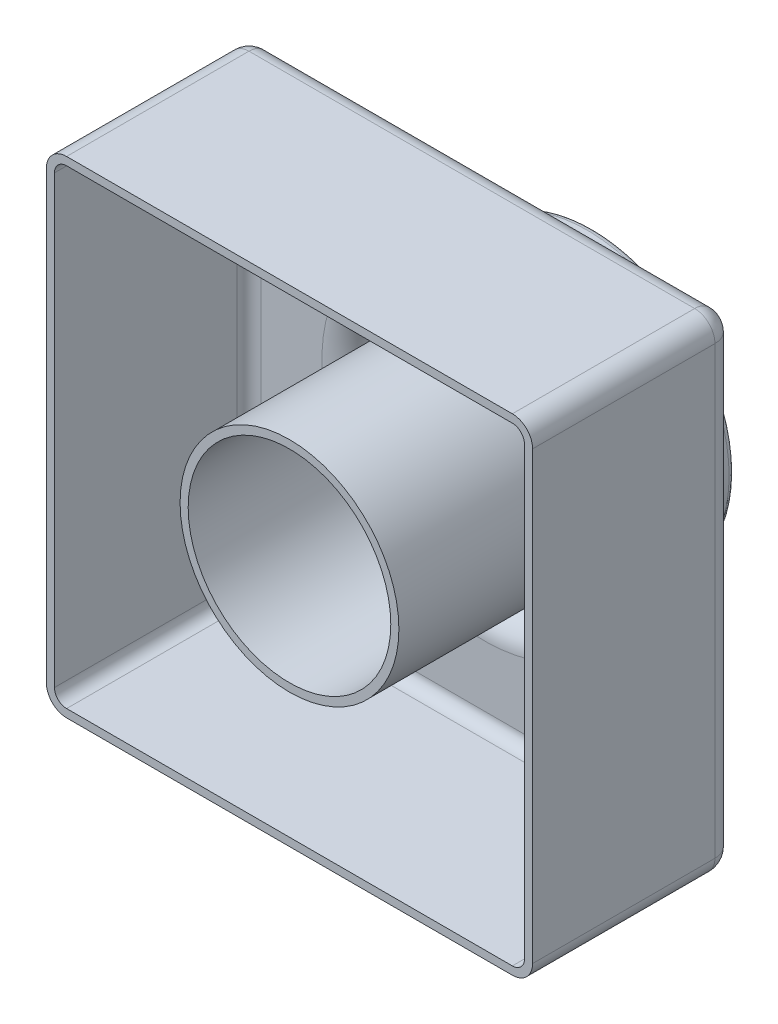
ISO-10303-21;
HEADER;
FILE_DESCRIPTION(('STEP AP214'),'2;1');
FILE_NAME('part.step','',(''),(''),'','','');
FILE_SCHEMA(('AUTOMOTIVE_DESIGN { 1 0 10303 214 1 1 1 1 }'));
ENDSEC;
DATA;
#1=APPLICATION_CONTEXT('core data for automotive mechanical design processes');
#2=APPLICATION_PROTOCOL_DEFINITION('international standard','automotive_design',2000,#1);
#3=PRODUCT_CONTEXT('',#1,'mechanical');
#4=PRODUCT('Part','Part','',(#3));
#5=PRODUCT_RELATED_PRODUCT_CATEGORY('part','',(#4));
#6=PRODUCT_DEFINITION_FORMATION('','',#4);
#7=PRODUCT_DEFINITION_CONTEXT('part definition',#1,'design');
#8=PRODUCT_DEFINITION('design','',#6,#7);
#9=PRODUCT_DEFINITION_SHAPE('','',#8);
#10=(LENGTH_UNIT() NAMED_UNIT(*) SI_UNIT(.MILLI.,.METRE.));
#11=(NAMED_UNIT(*) PLANE_ANGLE_UNIT() SI_UNIT($,.RADIAN.));
#12=(NAMED_UNIT(*) SI_UNIT($,.STERADIAN.) SOLID_ANGLE_UNIT());
#13=UNCERTAINTY_MEASURE_WITH_UNIT(LENGTH_MEASURE(1.E-05),#10,'distance_accuracy_value','');
#14=(GEOMETRIC_REPRESENTATION_CONTEXT(3) GLOBAL_UNCERTAINTY_ASSIGNED_CONTEXT((#13)) GLOBAL_UNIT_ASSIGNED_CONTEXT((#10,
#11,#12)) REPRESENTATION_CONTEXT('',''));
#15=CARTESIAN_POINT('',(0.,0.,0.));
#16=DIRECTION('',(0.,0.,1.));
#17=DIRECTION('',(1.,0.,0.));
#18=AXIS2_PLACEMENT_3D('',#15,#16,#17);
#19=CARTESIAN_POINT('',(0.,0.,50.));
#20=DIRECTION('',(0.,0.,1.));
#21=DIRECTION('',(1.,0.,0.));
#22=AXIS2_PLACEMENT_3D('',#19,#20,#21);
#23=PLANE('',#22);
#24=DIRECTION('',(1.,0.,0.));
#25=VECTOR('',#24,1.);
#26=CARTESIAN_POINT('',(0.,0.,50.));
#27=LINE('',#26,#25);
#28=CARTESIAN_POINT('',(5.,0.,50.));
#29=VERTEX_POINT('',#28);
#30=CARTESIAN_POINT('',(115.,0.,50.));
#31=VERTEX_POINT('',#30);
#32=EDGE_CURVE('E278',#29,#31,#27,.T.);
#33=ORIENTED_EDGE('',*,*,#32,.F.);
#34=CARTESIAN_POINT('',(5.,-5.,50.));
#35=DIRECTION('',(0.,0.,1.));
#36=DIRECTION('',(1.,0.,0.));
#37=AXIS2_PLACEMENT_3D('',#34,#35,#36);
#38=CIRCLE('',#37,5.);
#39=CARTESIAN_POINT('',(0.,-5.,50.));
#40=VERTEX_POINT('',#39);
#41=EDGE_CURVE('E304',#29,#40,#38,.T.);
#42=ORIENTED_EDGE('',*,*,#41,.T.);
#43=DIRECTION('',(0.,-1.,0.));
#44=VECTOR('',#43,1.);
#45=CARTESIAN_POINT('',(0.,0.,50.));
#46=LINE('',#45,#44);
#47=CARTESIAN_POINT('',(0.,-115.,50.));
#48=VERTEX_POINT('',#47);
#49=EDGE_CURVE('E266',#40,#48,#46,.T.);
#50=ORIENTED_EDGE('',*,*,#49,.T.);
#51=CARTESIAN_POINT('',(5.,-115.,50.));
#52=DIRECTION('',(0.,0.,1.));
#53=DIRECTION('',(1.,0.,0.));
#54=AXIS2_PLACEMENT_3D('',#51,#52,#53);
#55=CIRCLE('',#54,5.);
#56=CARTESIAN_POINT('',(5.,-120.,50.));
#57=VERTEX_POINT('',#56);
#58=EDGE_CURVE('E301',#48,#57,#55,.T.);
#59=ORIENTED_EDGE('',*,*,#58,.T.);
#60=DIRECTION('',(1.,0.,0.));
#61=VECTOR('',#60,1.);
#62=CARTESIAN_POINT('',(0.,-120.,50.));
#63=LINE('',#62,#61);
#64=CARTESIAN_POINT('',(115.,-120.,50.));
#65=VERTEX_POINT('',#64);
#66=EDGE_CURVE('E270',#57,#65,#63,.T.);
#67=ORIENTED_EDGE('',*,*,#66,.T.);
#68=CARTESIAN_POINT('',(115.,-115.,50.));
#69=DIRECTION('',(0.,0.,1.));
#70=DIRECTION('',(1.,0.,0.));
#71=AXIS2_PLACEMENT_3D('',#68,#69,#70);
#72=CIRCLE('',#71,5.);
#73=CARTESIAN_POINT('',(120.,-115.,50.));
#74=VERTEX_POINT('',#73);
#75=EDGE_CURVE('E298',#65,#74,#72,.T.);
#76=ORIENTED_EDGE('',*,*,#75,.T.);
#77=DIRECTION('',(0.,-1.,0.));
#78=VECTOR('',#77,1.);
#79=CARTESIAN_POINT('',(120.,0.,50.));
#80=LINE('',#79,#78);
#81=CARTESIAN_POINT('',(120.,-5.,50.));
#82=VERTEX_POINT('',#81);
#83=EDGE_CURVE('E274',#82,#74,#80,.T.);
#84=ORIENTED_EDGE('',*,*,#83,.F.);
#85=CARTESIAN_POINT('',(115.,-5.,50.));
#86=DIRECTION('',(0.,0.,1.));
#87=DIRECTION('',(1.,0.,0.));
#88=AXIS2_PLACEMENT_3D('',#85,#86,#87);
#89=CIRCLE('',#88,5.);
#90=EDGE_CURVE('E295',#82,#31,#89,.T.);
#91=ORIENTED_EDGE('',*,*,#90,.T.);
#92=EDGE_LOOP('',(#33,#42,#50,#59,#67,#76,#84,#91));
#93=FACE_BOUND('',#92,.T.);
#94=CARTESIAN_POINT('',(5.,-5.,50.));
#95=DIRECTION('',(0.,0.,1.));
#96=DIRECTION('',(1.,0.,0.));
#97=AXIS2_PLACEMENT_3D('',#94,#95,#96);
#98=CIRCLE('',#97,3.);
#99=CARTESIAN_POINT('',(5.,-2.,50.));
#100=VERTEX_POINT('',#99);
#101=CARTESIAN_POINT('',(2.,-5.,50.));
#102=VERTEX_POINT('',#101);
#103=EDGE_CURVE('E239',#100,#102,#98,.T.);
#104=ORIENTED_EDGE('',*,*,#103,.F.);
#105=DIRECTION('',(1.,0.,0.));
#106=VECTOR('',#105,1.);
#107=CARTESIAN_POINT('',(0.,-2.,50.));
#108=LINE('',#107,#106);
#109=CARTESIAN_POINT('',(115.,-2.,50.));
#110=VERTEX_POINT('',#109);
#111=EDGE_CURVE('E209',#100,#110,#108,.T.);
#112=ORIENTED_EDGE('',*,*,#111,.T.);
#113=CARTESIAN_POINT('',(115.,-5.,50.));
#114=DIRECTION('',(0.,0.,1.));
#115=DIRECTION('',(1.,0.,0.));
#116=AXIS2_PLACEMENT_3D('',#113,#114,#115);
#117=CIRCLE('',#116,3.);
#118=CARTESIAN_POINT('',(118.,-5.,50.));
#119=VERTEX_POINT('',#118);
#120=EDGE_CURVE('E246',#119,#110,#117,.T.);
#121=ORIENTED_EDGE('',*,*,#120,.F.);
#122=DIRECTION('',(0.,-1.,0.));
#123=VECTOR('',#122,1.);
#124=CARTESIAN_POINT('',(118.,0.,50.));
#125=LINE('',#124,#123);
#126=CARTESIAN_POINT('',(118.,-115.,50.));
#127=VERTEX_POINT('',#126);
#128=EDGE_CURVE('E61',#119,#127,#125,.T.);
#129=ORIENTED_EDGE('',*,*,#128,.T.);
#130=CARTESIAN_POINT('',(115.,-115.,50.));
#131=DIRECTION('',(0.,0.,1.));
#132=DIRECTION('',(1.,0.,0.));
#133=AXIS2_PLACEMENT_3D('',#130,#131,#132);
#134=CIRCLE('',#133,3.);
#135=CARTESIAN_POINT('',(115.,-118.,50.));
#136=VERTEX_POINT('',#135);
#137=EDGE_CURVE('E240',#136,#127,#134,.T.);
#138=ORIENTED_EDGE('',*,*,#137,.F.);
#139=DIRECTION('',(1.,0.,0.));
#140=VECTOR('',#139,1.);
#141=CARTESIAN_POINT('',(0.,-118.,50.));
#142=LINE('',#141,#140);
#143=CARTESIAN_POINT('',(5.,-118.,50.));
#144=VERTEX_POINT('',#143);
#145=EDGE_CURVE('E234',#144,#136,#142,.T.);
#146=ORIENTED_EDGE('',*,*,#145,.F.);
#147=CARTESIAN_POINT('',(5.,-115.,50.));
#148=DIRECTION('',(0.,0.,1.));
#149=DIRECTION('',(1.,0.,0.));
#150=AXIS2_PLACEMENT_3D('',#147,#148,#149);
#151=CIRCLE('',#150,3.);
#152=CARTESIAN_POINT('',(2.,-115.,50.));
#153=VERTEX_POINT('',#152);
#154=EDGE_CURVE('E236',#153,#144,#151,.T.);
#155=ORIENTED_EDGE('',*,*,#154,.F.);
#156=DIRECTION('',(0.,-1.,0.));
#157=VECTOR('',#156,1.);
#158=CARTESIAN_POINT('',(2.,0.,50.));
#159=LINE('',#158,#157);
#160=EDGE_CURVE('E204',#102,#153,#159,.T.);
#161=ORIENTED_EDGE('',*,*,#160,.F.);
#162=EDGE_LOOP('',(#104,#112,#121,#129,#138,#146,#155,#161));
#163=FACE_BOUND('',#162,.T.);
#164=ADVANCED_FACE('F43',(#93,#163),#23,.T.);
#165=CARTESIAN_POINT('',(0.,0.,50.));
#166=DIRECTION('',(1.,0.,0.));
#167=DIRECTION('',(0.,0.,-1.));
#168=AXIS2_PLACEMENT_3D('',#165,#166,#167);
#169=PLANE('',#168);
#170=DIRECTION('',(0.,0.,-1.));
#171=VECTOR('',#170,1.);
#172=CARTESIAN_POINT('',(0.,-5.,0.));
#173=LINE('',#172,#171);
#174=CARTESIAN_POINT('',(0.,-5.,5.));
#175=VERTEX_POINT('',#174);
#176=EDGE_CURVE('E285',#40,#175,#173,.T.);
#177=ORIENTED_EDGE('',*,*,#176,.T.);
#178=DIRECTION('',(0.,-1.,0.));
#179=VECTOR('',#178,1.);
#180=CARTESIAN_POINT('',(0.,0.,5.));
#181=LINE('',#180,#179);
#182=CARTESIAN_POINT('',(0.,-115.,5.));
#183=VERTEX_POINT('',#182);
#184=EDGE_CURVE('E12',#175,#183,#181,.T.);
#185=ORIENTED_EDGE('',*,*,#184,.T.);
#186=DIRECTION('',(0.,0.,-1.));
#187=VECTOR('',#186,1.);
#188=CARTESIAN_POINT('',(0.,-115.,50.));
#189=LINE('',#188,#187);
#190=EDGE_CURVE('E282',#183,#48,#189,.F.);
#191=ORIENTED_EDGE('',*,*,#190,.T.);
#192=ORIENTED_EDGE('',*,*,#49,.F.);
#193=EDGE_LOOP('',(#177,#185,#191,#192));
#194=FACE_BOUND('',#193,.T.);
#195=ADVANCED_FACE('F433',(#194),#169,.F.);
#196=CARTESIAN_POINT('',(0.,-120.,50.));
#197=DIRECTION('',(0.,1.,0.));
#198=DIRECTION('',(0.,0.,1.));
#199=AXIS2_PLACEMENT_3D('',#196,#197,#198);
#200=PLANE('',#199);
#201=DIRECTION('',(0.,0.,-1.));
#202=VECTOR('',#201,1.);
#203=CARTESIAN_POINT('',(5.,-120.,50.));
#204=LINE('',#203,#202);
#205=CARTESIAN_POINT('',(5.,-120.,5.));
#206=VERTEX_POINT('',#205);
#207=EDGE_CURVE('E310',#57,#206,#204,.T.);
#208=ORIENTED_EDGE('',*,*,#207,.T.);
#209=DIRECTION('',(1.,0.,0.));
#210=VECTOR('',#209,1.);
#211=CARTESIAN_POINT('',(0.,-120.,5.));
#212=LINE('',#211,#210);
#213=CARTESIAN_POINT('',(115.,-120.,5.));
#214=VERTEX_POINT('',#213);
#215=EDGE_CURVE('E349',#206,#214,#212,.T.);
#216=ORIENTED_EDGE('',*,*,#215,.T.);
#217=DIRECTION('',(0.,0.,-1.));
#218=VECTOR('',#217,1.);
#219=CARTESIAN_POINT('',(115.,-120.,50.));
#220=LINE('',#219,#218);
#221=EDGE_CURVE('E307',#214,#65,#220,.F.);
#222=ORIENTED_EDGE('',*,*,#221,.T.);
#223=ORIENTED_EDGE('',*,*,#66,.F.);
#224=EDGE_LOOP('',(#208,#216,#222,#223));
#225=FACE_BOUND('',#224,.T.);
#226=ADVANCED_FACE('F458',(#225),#200,.F.);
#227=CARTESIAN_POINT('',(120.,0.,50.));
#228=DIRECTION('',(1.,0.,0.));
#229=DIRECTION('',(0.,1.,0.));
#230=AXIS2_PLACEMENT_3D('',#227,#228,#229);
#231=PLANE('',#230);
#232=DIRECTION('',(0.,0.,-1.));
#233=VECTOR('',#232,1.);
#234=CARTESIAN_POINT('',(120.,-115.,0.));
#235=LINE('',#234,#233);
#236=CARTESIAN_POINT('',(120.,-115.,5.));
#237=VERTEX_POINT('',#236);
#238=EDGE_CURVE('E317',#74,#237,#235,.T.);
#239=ORIENTED_EDGE('',*,*,#238,.T.);
#240=DIRECTION('',(0.,-1.,0.));
#241=VECTOR('',#240,1.);
#242=CARTESIAN_POINT('',(120.,-5.,5.));
#243=LINE('',#242,#241);
#244=CARTESIAN_POINT('',(120.,-5.,5.));
#245=VERTEX_POINT('',#244);
#246=EDGE_CURVE('E368',#237,#245,#243,.F.);
#247=ORIENTED_EDGE('',*,*,#246,.T.);
#248=DIRECTION('',(0.,0.,-1.));
#249=VECTOR('',#248,1.);
#250=CARTESIAN_POINT('',(120.,-5.,50.));
#251=LINE('',#250,#249);
#252=EDGE_CURVE('E314',#245,#82,#251,.F.);
#253=ORIENTED_EDGE('',*,*,#252,.T.);
#254=ORIENTED_EDGE('',*,*,#83,.T.);
#255=EDGE_LOOP('',(#239,#247,#253,#254));
#256=FACE_BOUND('',#255,.T.);
#257=ADVANCED_FACE('F465',(#256),#231,.T.);
#258=CARTESIAN_POINT('',(0.,0.,50.));
#259=DIRECTION('',(0.,1.,0.));
#260=DIRECTION('',(0.,0.,1.));
#261=AXIS2_PLACEMENT_3D('',#258,#259,#260);
#262=PLANE('',#261);
#263=DIRECTION('',(0.,0.,-1.));
#264=VECTOR('',#263,1.);
#265=CARTESIAN_POINT('',(115.,0.,50.));
#266=LINE('',#265,#264);
#267=CARTESIAN_POINT('',(115.,0.,5.));
#268=VERTEX_POINT('',#267);
#269=EDGE_CURVE('E288',#31,#268,#266,.T.);
#270=ORIENTED_EDGE('',*,*,#269,.T.);
#271=DIRECTION('',(1.,0.,0.));
#272=VECTOR('',#271,1.);
#273=CARTESIAN_POINT('',(5.,0.,5.));
#274=LINE('',#273,#272);
#275=CARTESIAN_POINT('',(5.,0.,5.));
#276=VERTEX_POINT('',#275);
#277=EDGE_CURVE('E374',#268,#276,#274,.F.);
#278=ORIENTED_EDGE('',*,*,#277,.T.);
#279=DIRECTION('',(0.,0.,-1.));
#280=VECTOR('',#279,1.);
#281=CARTESIAN_POINT('',(5.,0.,50.));
#282=LINE('',#281,#280);
#283=EDGE_CURVE('E292',#276,#29,#282,.F.);
#284=ORIENTED_EDGE('',*,*,#283,.T.);
#285=ORIENTED_EDGE('',*,*,#32,.T.);
#286=EDGE_LOOP('',(#270,#278,#284,#285));
#287=FACE_BOUND('',#286,.T.);
#288=ADVANCED_FACE('F422',(#287),#262,.T.);
#289=CARTESIAN_POINT('',(60.,-60.,50.));
#290=DIRECTION('',(0.,0.,1.));
#291=DIRECTION('',(1.,0.,0.));
#292=AXIS2_PLACEMENT_3D('',#289,#290,#291);
#293=CIRCLE('',#292,27.);
#294=CARTESIAN_POINT('',(87.,-60.,50.));
#295=VERTEX_POINT('',#294);
#296=EDGE_CURVE('E235',#295,#295,#293,.F.);
#297=ORIENTED_EDGE('',*,*,#296,.F.);
#298=EDGE_LOOP('',(#297));
#299=FACE_BOUND('',#298,.T.);
#300=CARTESIAN_POINT('',(60.,-60.,50.));
#301=DIRECTION('',(0.,0.,-1.));
#302=DIRECTION('',(-1.,0.,0.));
#303=AXIS2_PLACEMENT_3D('',#300,#301,#302);
#304=CIRCLE('',#303,25.);
#305=CARTESIAN_POINT('',(35.,-60.,50.));
#306=VERTEX_POINT('',#305);
#307=EDGE_CURVE('E262',#306,#306,#304,.T.);
#308=ORIENTED_EDGE('',*,*,#307,.T.);
#309=EDGE_LOOP('',(#308));
#310=FACE_BOUND('',#309,.T.);
#311=ADVANCED_FACE('F472',(#299,#310),#23,.T.);
#312=CARTESIAN_POINT('',(0.,0.,0.));
#313=DIRECTION('',(0.,0.,1.));
#314=DIRECTION('',(1.,0.,0.));
#315=AXIS2_PLACEMENT_3D('',#312,#313,#314);
#316=PLANE('',#315);
#317=DIRECTION('',(0.,-1.,0.));
#318=VECTOR('',#317,1.);
#319=CARTESIAN_POINT('',(115.,-115.,0.));
#320=LINE('',#319,#318);
#321=CARTESIAN_POINT('',(115.,-5.,0.));
#322=VERTEX_POINT('',#321);
#323=CARTESIAN_POINT('',(115.,-115.,0.));
#324=VERTEX_POINT('',#323);
#325=EDGE_CURVE('E358',#322,#324,#320,.T.);
#326=ORIENTED_EDGE('',*,*,#325,.T.);
#327=DIRECTION('',(1.,0.,0.));
#328=VECTOR('',#327,1.);
#329=CARTESIAN_POINT('',(0.,-115.,0.));
#330=LINE('',#329,#328);
#331=CARTESIAN_POINT('',(5.,-115.,0.));
#332=VERTEX_POINT('',#331);
#333=EDGE_CURVE('E361',#324,#332,#330,.F.);
#334=ORIENTED_EDGE('',*,*,#333,.T.);
#335=DIRECTION('',(0.,-1.,0.));
#336=VECTOR('',#335,1.);
#337=CARTESIAN_POINT('',(5.,0.,0.));
#338=LINE('',#337,#336);
#339=CARTESIAN_POINT('',(5.,-5.,0.));
#340=VERTEX_POINT('',#339);
#341=EDGE_CURVE('E352',#332,#340,#338,.F.);
#342=ORIENTED_EDGE('',*,*,#341,.T.);
#343=DIRECTION('',(1.,0.,0.));
#344=VECTOR('',#343,1.);
#345=CARTESIAN_POINT('',(115.,-5.,0.));
#346=LINE('',#345,#344);
#347=EDGE_CURVE('E355',#340,#322,#346,.T.);
#348=ORIENTED_EDGE('',*,*,#347,.T.);
#349=EDGE_LOOP('',(#326,#334,#342,#348));
#350=FACE_BOUND('',#349,.T.);
#351=CARTESIAN_POINT('',(60.,-60.,0.));
#352=DIRECTION('',(0.,0.,1.));
#353=DIRECTION('',(1.,0.,0.));
#354=AXIS2_PLACEMENT_3D('',#351,#352,#353);
#355=CIRCLE('',#354,40.);
#356=CARTESIAN_POINT('',(100.,-60.,0.));
#357=VERTEX_POINT('',#356);
#358=EDGE_CURVE('E321',#357,#357,#355,.T.);
#359=ORIENTED_EDGE('',*,*,#358,.T.);
#360=EDGE_LOOP('',(#359));
#361=FACE_BOUND('',#360,.T.);
#362=ADVANCED_FACE('F484',(#350,#361),#316,.F.);
#363=CARTESIAN_POINT('',(60.,-60.,-25.));
#364=DIRECTION('',(0.,0.,1.));
#365=DIRECTION('',(1.,0.,0.));
#366=AXIS2_PLACEMENT_3D('',#363,#364,#365);
#367=CYLINDRICAL_SURFACE('',#366,35.);
#368=CARTESIAN_POINT('',(60.,-60.,-23.5));
#369=DIRECTION('',(0.,0.,1.));
#370=DIRECTION('',(1.,0.,0.));
#371=AXIS2_PLACEMENT_3D('',#368,#369,#370);
#372=CIRCLE('',#371,35.);
#373=CARTESIAN_POINT('',(95.,-60.,-23.5));
#374=VERTEX_POINT('',#373);
#375=EDGE_CURVE('E329',#374,#374,#372,.T.);
#376=ORIENTED_EDGE('',*,*,#375,.T.);
#377=EDGE_LOOP('',(#376));
#378=FACE_BOUND('',#377,.T.);
#379=CARTESIAN_POINT('',(60.,-60.,-5.));
#380=DIRECTION('',(0.,0.,1.));
#381=DIRECTION('',(1.,0.,0.));
#382=AXIS2_PLACEMENT_3D('',#379,#380,#381);
#383=CIRCLE('',#382,35.);
#384=CARTESIAN_POINT('',(95.,-60.,-5.));
#385=VERTEX_POINT('',#384);
#386=EDGE_CURVE('E325',#385,#385,#383,.F.);
#387=ORIENTED_EDGE('',*,*,#386,.T.);
#388=EDGE_LOOP('',(#387));
#389=FACE_BOUND('',#388,.T.);
#390=ADVANCED_FACE('F489',(#378,#389),#367,.T.);
#391=CARTESIAN_POINT('',(60.,-60.,-25.));
#392=DIRECTION('',(0.,0.,1.));
#393=DIRECTION('',(1.,0.,0.));
#394=AXIS2_PLACEMENT_3D('',#391,#392,#393);
#395=PLANE('',#394);
#396=CARTESIAN_POINT('',(60.,-60.,-25.));
#397=DIRECTION('',(0.,0.,1.));
#398=DIRECTION('',(1.,0.,0.));
#399=AXIS2_PLACEMENT_3D('',#396,#397,#398);
#400=CIRCLE('',#399,33.5);
#401=CARTESIAN_POINT('',(93.5,-60.,-25.));
#402=VERTEX_POINT('',#401);
#403=EDGE_CURVE('E337',#402,#402,#400,.F.);
#404=ORIENTED_EDGE('',*,*,#403,.T.);
#405=EDGE_LOOP('',(#404));
#406=FACE_BOUND('',#405,.T.);
#407=CARTESIAN_POINT('',(60.,-60.,-25.));
#408=DIRECTION('',(0.,0.,1.));
#409=DIRECTION('',(1.,0.,0.));
#410=AXIS2_PLACEMENT_3D('',#407,#408,#409);
#411=CIRCLE('',#410,26.5);
#412=CARTESIAN_POINT('',(86.5,-60.,-25.));
#413=VERTEX_POINT('',#412);
#414=EDGE_CURVE('E333',#413,#413,#411,.T.);
#415=ORIENTED_EDGE('',*,*,#414,.T.);
#416=EDGE_LOOP('',(#415));
#417=FACE_BOUND('',#416,.T.);
#418=ADVANCED_FACE('F497',(#406,#417),#395,.F.);
#419=CARTESIAN_POINT('',(60.,-60.,50.));
#420=DIRECTION('',(0.,0.,-1.));
#421=DIRECTION('',(-1.,0.,0.));
#422=AXIS2_PLACEMENT_3D('',#419,#420,#421);
#423=CYLINDRICAL_SURFACE('',#422,25.);
#424=CARTESIAN_POINT('',(60.,-60.,-23.5));
#425=DIRECTION('',(0.,0.,1.));
#426=DIRECTION('',(1.,0.,0.));
#427=AXIS2_PLACEMENT_3D('',#424,#425,#426);
#428=CIRCLE('',#427,25.);
#429=CARTESIAN_POINT('',(85.,-60.,-23.5));
#430=VERTEX_POINT('',#429);
#431=EDGE_CURVE('E341',#430,#430,#428,.F.);
#432=ORIENTED_EDGE('',*,*,#431,.T.);
#433=EDGE_LOOP('',(#432));
#434=FACE_BOUND('',#433,.T.);
#435=ORIENTED_EDGE('',*,*,#307,.F.);
#436=EDGE_LOOP('',(#435));
#437=FACE_BOUND('',#436,.T.);
#438=ADVANCED_FACE('F495',(#434,#437),#423,.F.);
#439=CARTESIAN_POINT('',(5.,-5.,50.));
#440=DIRECTION('',(0.,0.,1.));
#441=DIRECTION('',(1.,0.,0.));
#442=AXIS2_PLACEMENT_3D('',#439,#440,#441);
#443=CYLINDRICAL_SURFACE('',#442,5.);
#444=ORIENTED_EDGE('',*,*,#283,.F.);
#445=CARTESIAN_POINT('',(5.,-5.,5.));
#446=DIRECTION('',(0.,0.,1.));
#447=DIRECTION('',(1.,0.,0.));
#448=AXIS2_PLACEMENT_3D('',#445,#446,#447);
#449=CIRCLE('',#448,5.);
#450=EDGE_CURVE('E53',#276,#175,#449,.T.);
#451=ORIENTED_EDGE('',*,*,#450,.T.);
#452=ORIENTED_EDGE('',*,*,#176,.F.);
#453=ORIENTED_EDGE('',*,*,#41,.F.);
#454=EDGE_LOOP('',(#444,#451,#452,#453));
#455=FACE_BOUND('',#454,.T.);
#456=ADVANCED_FACE('F429',(#455),#443,.T.);
#457=CARTESIAN_POINT('',(5.,-115.,50.));
#458=DIRECTION('',(0.,0.,-1.));
#459=DIRECTION('',(-1.,0.,0.));
#460=AXIS2_PLACEMENT_3D('',#457,#458,#459);
#461=CYLINDRICAL_SURFACE('',#460,5.);
#462=ORIENTED_EDGE('',*,*,#190,.F.);
#463=CARTESIAN_POINT('',(5.,-115.,5.));
#464=DIRECTION('',(0.,0.,-1.));
#465=DIRECTION('',(-1.,0.,0.));
#466=AXIS2_PLACEMENT_3D('',#463,#464,#465);
#467=CIRCLE('',#466,5.);
#468=EDGE_CURVE('E345',#183,#206,#467,.F.);
#469=ORIENTED_EDGE('',*,*,#468,.T.);
#470=ORIENTED_EDGE('',*,*,#207,.F.);
#471=ORIENTED_EDGE('',*,*,#58,.F.);
#472=EDGE_LOOP('',(#462,#469,#470,#471));
#473=FACE_BOUND('',#472,.T.);
#474=ADVANCED_FACE('F455',(#473),#461,.T.);
#475=CARTESIAN_POINT('',(115.,-115.,50.));
#476=DIRECTION('',(0.,0.,1.));
#477=DIRECTION('',(1.,0.,0.));
#478=AXIS2_PLACEMENT_3D('',#475,#476,#477);
#479=CYLINDRICAL_SURFACE('',#478,5.);
#480=ORIENTED_EDGE('',*,*,#221,.F.);
#481=CARTESIAN_POINT('',(115.,-115.,5.));
#482=DIRECTION('',(0.,0.,1.));
#483=DIRECTION('',(1.,0.,0.));
#484=AXIS2_PLACEMENT_3D('',#481,#482,#483);
#485=CIRCLE('',#484,5.);
#486=EDGE_CURVE('E365',#214,#237,#485,.T.);
#487=ORIENTED_EDGE('',*,*,#486,.T.);
#488=ORIENTED_EDGE('',*,*,#238,.F.);
#489=ORIENTED_EDGE('',*,*,#75,.F.);
#490=EDGE_LOOP('',(#480,#487,#488,#489));
#491=FACE_BOUND('',#490,.T.);
#492=ADVANCED_FACE('F462',(#491),#479,.T.);
#493=CARTESIAN_POINT('',(115.,-5.,50.));
#494=DIRECTION('',(0.,0.,-1.));
#495=DIRECTION('',(-1.,0.,0.));
#496=AXIS2_PLACEMENT_3D('',#493,#494,#495);
#497=CYLINDRICAL_SURFACE('',#496,5.);
#498=ORIENTED_EDGE('',*,*,#252,.F.);
#499=CARTESIAN_POINT('',(115.,-5.,5.));
#500=DIRECTION('',(0.,0.,-1.));
#501=DIRECTION('',(-1.,0.,0.));
#502=AXIS2_PLACEMENT_3D('',#499,#500,#501);
#503=CIRCLE('',#502,5.);
#504=EDGE_CURVE('E371',#245,#268,#503,.F.);
#505=ORIENTED_EDGE('',*,*,#504,.T.);
#506=ORIENTED_EDGE('',*,*,#269,.F.);
#507=ORIENTED_EDGE('',*,*,#90,.F.);
#508=EDGE_LOOP('',(#498,#505,#506,#507));
#509=FACE_BOUND('',#508,.T.);
#510=ADVANCED_FACE('F419',(#509),#497,.T.);
#511=CARTESIAN_POINT('',(60.,-60.,-5.));
#512=DIRECTION('',(0.,0.,1.));
#513=DIRECTION('',(1.,0.,0.));
#514=AXIS2_PLACEMENT_3D('',#511,#512,#513);
#515=TOROIDAL_SURFACE('',#514,40.,5.);
#516=ORIENTED_EDGE('',*,*,#386,.F.);
#517=EDGE_LOOP('',(#516));
#518=FACE_BOUND('',#517,.T.);
#519=ORIENTED_EDGE('',*,*,#358,.F.);
#520=EDGE_LOOP('',(#519));
#521=FACE_BOUND('',#520,.T.);
#522=ADVANCED_FACE('F517',(#518,#521),#515,.F.);
#523=CARTESIAN_POINT('',(60.,-60.,-23.5));
#524=DIRECTION('',(0.,0.,1.));
#525=DIRECTION('',(1.,0.,0.));
#526=AXIS2_PLACEMENT_3D('',#523,#524,#525);
#527=TOROIDAL_SURFACE('',#526,33.5,1.5);
#528=ORIENTED_EDGE('',*,*,#403,.F.);
#529=EDGE_LOOP('',(#528));
#530=FACE_BOUND('',#529,.T.);
#531=ORIENTED_EDGE('',*,*,#375,.F.);
#532=EDGE_LOOP('',(#531));
#533=FACE_BOUND('',#532,.T.);
#534=ADVANCED_FACE('F520',(#530,#533),#527,.T.);
#535=CARTESIAN_POINT('',(60.,-60.,-23.5));
#536=DIRECTION('',(0.,0.,1.));
#537=DIRECTION('',(1.,0.,0.));
#538=AXIS2_PLACEMENT_3D('',#535,#536,#537);
#539=TOROIDAL_SURFACE('',#538,26.5,1.5);
#540=ORIENTED_EDGE('',*,*,#414,.F.);
#541=EDGE_LOOP('',(#540));
#542=FACE_BOUND('',#541,.T.);
#543=ORIENTED_EDGE('',*,*,#431,.F.);
#544=EDGE_LOOP('',(#543));
#545=FACE_BOUND('',#544,.T.);
#546=ADVANCED_FACE('F528',(#542,#545),#539,.T.);
#547=CARTESIAN_POINT('',(115.,-5.,5.));
#548=DIRECTION('',(0.,0.,1.));
#549=DIRECTION('',(1.,0.,0.));
#550=AXIS2_PLACEMENT_3D('',#547,#548,#549);
#551=SPHERICAL_SURFACE('',#550,5.);
#552=CARTESIAN_POINT('',(115.,-5.,5.));
#553=DIRECTION('',(-1.,0.,0.));
#554=DIRECTION('',(0.,0.,1.));
#555=AXIS2_PLACEMENT_3D('',#552,#553,#554);
#556=CIRCLE('',#555,5.);
#557=EDGE_CURVE('E399',#268,#322,#556,.T.);
#558=ORIENTED_EDGE('',*,*,#557,.F.);
#559=ORIENTED_EDGE('',*,*,#504,.F.);
#560=CARTESIAN_POINT('',(115.,-5.,5.));
#561=DIRECTION('',(0.,-1.,0.));
#562=DIRECTION('',(1.,0.,0.));
#563=AXIS2_PLACEMENT_3D('',#560,#561,#562);
#564=CIRCLE('',#563,5.);
#565=EDGE_CURVE('E47',#322,#245,#564,.T.);
#566=ORIENTED_EDGE('',*,*,#565,.F.);
#567=EDGE_LOOP('',(#558,#559,#566));
#568=FACE_BOUND('',#567,.T.);
#569=ADVANCED_FACE('F45',(#568),#551,.T.);
#570=CARTESIAN_POINT('',(115.,0.,5.));
#571=DIRECTION('',(0.,1.,0.));
#572=DIRECTION('',(-1.,0.,0.));
#573=AXIS2_PLACEMENT_3D('',#570,#571,#572);
#574=CYLINDRICAL_SURFACE('',#573,5.);
#575=ORIENTED_EDGE('',*,*,#565,.T.);
#576=ORIENTED_EDGE('',*,*,#246,.F.);
#577=CARTESIAN_POINT('',(115.,-115.,5.));
#578=DIRECTION('',(0.,-1.,0.));
#579=DIRECTION('',(0.,0.,-1.));
#580=AXIS2_PLACEMENT_3D('',#577,#578,#579);
#581=CIRCLE('',#580,5.);
#582=EDGE_CURVE('E396',#324,#237,#581,.T.);
#583=ORIENTED_EDGE('',*,*,#582,.F.);
#584=ORIENTED_EDGE('',*,*,#325,.F.);
#585=EDGE_LOOP('',(#575,#576,#583,#584));
#586=FACE_BOUND('',#585,.T.);
#587=ADVANCED_FACE('F412',(#586),#574,.T.);
#588=CARTESIAN_POINT('',(0.,-5.,5.));
#589=DIRECTION('',(-1.,0.,0.));
#590=DIRECTION('',(0.,0.,1.));
#591=AXIS2_PLACEMENT_3D('',#588,#589,#590);
#592=CYLINDRICAL_SURFACE('',#591,5.);
#593=ORIENTED_EDGE('',*,*,#557,.T.);
#594=ORIENTED_EDGE('',*,*,#347,.F.);
#595=CARTESIAN_POINT('',(5.,-5.,5.));
#596=DIRECTION('',(-1.,0.,0.));
#597=DIRECTION('',(0.,0.,1.));
#598=AXIS2_PLACEMENT_3D('',#595,#596,#597);
#599=CIRCLE('',#598,5.);
#600=EDGE_CURVE('E392',#276,#340,#599,.T.);
#601=ORIENTED_EDGE('',*,*,#600,.F.);
#602=ORIENTED_EDGE('',*,*,#277,.F.);
#603=EDGE_LOOP('',(#593,#594,#601,#602));
#604=FACE_BOUND('',#603,.T.);
#605=ADVANCED_FACE('F548',(#604),#592,.T.);
#606=CARTESIAN_POINT('',(115.,-115.,5.));
#607=DIRECTION('',(0.,0.,1.));
#608=DIRECTION('',(1.,0.,0.));
#609=AXIS2_PLACEMENT_3D('',#606,#607,#608);
#610=SPHERICAL_SURFACE('',#609,5.);
#611=ORIENTED_EDGE('',*,*,#582,.T.);
#612=ORIENTED_EDGE('',*,*,#486,.F.);
#613=CARTESIAN_POINT('',(115.,-115.,5.));
#614=DIRECTION('',(-1.,0.,0.));
#615=DIRECTION('',(0.,0.,1.));
#616=AXIS2_PLACEMENT_3D('',#613,#614,#615);
#617=CIRCLE('',#616,5.);
#618=EDGE_CURVE('E388',#324,#214,#617,.T.);
#619=ORIENTED_EDGE('',*,*,#618,.F.);
#620=EDGE_LOOP('',(#611,#612,#619));
#621=FACE_BOUND('',#620,.T.);
#622=ADVANCED_FACE('F545',(#621),#610,.T.);
#623=CARTESIAN_POINT('',(5.,-5.,5.));
#624=DIRECTION('',(0.,0.,1.));
#625=DIRECTION('',(1.,0.,0.));
#626=AXIS2_PLACEMENT_3D('',#623,#624,#625);
#627=SPHERICAL_SURFACE('',#626,5.);
#628=ORIENTED_EDGE('',*,*,#450,.F.);
#629=ORIENTED_EDGE('',*,*,#600,.T.);
#630=CARTESIAN_POINT('',(5.,-5.,5.));
#631=DIRECTION('',(0.,-1.,0.));
#632=DIRECTION('',(0.,0.,-1.));
#633=AXIS2_PLACEMENT_3D('',#630,#631,#632);
#634=CIRCLE('',#633,5.);
#635=EDGE_CURVE('E384',#175,#340,#634,.T.);
#636=ORIENTED_EDGE('',*,*,#635,.F.);
#637=EDGE_LOOP('',(#628,#629,#636));
#638=FACE_BOUND('',#637,.T.);
#639=ADVANCED_FACE('F437',(#638),#627,.T.);
#640=CARTESIAN_POINT('',(0.,-115.,5.));
#641=DIRECTION('',(1.,0.,0.));
#642=DIRECTION('',(0.,0.,-1.));
#643=AXIS2_PLACEMENT_3D('',#640,#641,#642);
#644=CYLINDRICAL_SURFACE('',#643,5.);
#645=ORIENTED_EDGE('',*,*,#618,.T.);
#646=ORIENTED_EDGE('',*,*,#215,.F.);
#647=CARTESIAN_POINT('',(5.,-115.,5.));
#648=DIRECTION('',(-1.,0.,0.));
#649=DIRECTION('',(0.,0.,1.));
#650=AXIS2_PLACEMENT_3D('',#647,#648,#649);
#651=CIRCLE('',#650,5.);
#652=EDGE_CURVE('E381',#332,#206,#651,.T.);
#653=ORIENTED_EDGE('',*,*,#652,.F.);
#654=ORIENTED_EDGE('',*,*,#333,.F.);
#655=EDGE_LOOP('',(#645,#646,#653,#654));
#656=FACE_BOUND('',#655,.T.);
#657=ADVANCED_FACE('F449',(#656),#644,.T.);
#658=CARTESIAN_POINT('',(5.,0.,5.));
#659=DIRECTION('',(0.,-1.,0.));
#660=DIRECTION('',(0.,0.,-1.));
#661=AXIS2_PLACEMENT_3D('',#658,#659,#660);
#662=CYLINDRICAL_SURFACE('',#661,5.);
#663=ORIENTED_EDGE('',*,*,#635,.T.);
#664=ORIENTED_EDGE('',*,*,#341,.F.);
#665=CARTESIAN_POINT('',(5.,-115.,5.));
#666=DIRECTION('',(0.,-1.,0.));
#667=DIRECTION('',(0.,0.,-1.));
#668=AXIS2_PLACEMENT_3D('',#665,#666,#667);
#669=CIRCLE('',#668,5.);
#670=EDGE_CURVE('E196',#183,#332,#669,.T.);
#671=ORIENTED_EDGE('',*,*,#670,.F.);
#672=ORIENTED_EDGE('',*,*,#184,.F.);
#673=EDGE_LOOP('',(#663,#664,#671,#672));
#674=FACE_BOUND('',#673,.T.);
#675=ADVANCED_FACE('F441',(#674),#662,.T.);
#676=CARTESIAN_POINT('',(5.,-115.,5.));
#677=DIRECTION('',(0.,0.,1.));
#678=DIRECTION('',(1.,0.,0.));
#679=AXIS2_PLACEMENT_3D('',#676,#677,#678);
#680=SPHERICAL_SURFACE('',#679,5.);
#681=ORIENTED_EDGE('',*,*,#652,.T.);
#682=ORIENTED_EDGE('',*,*,#468,.F.);
#683=ORIENTED_EDGE('',*,*,#670,.T.);
#684=EDGE_LOOP('',(#681,#682,#683));
#685=FACE_BOUND('',#684,.T.);
#686=ADVANCED_FACE('F445',(#685),#680,.T.);
#687=CARTESIAN_POINT('',(2.,0.,50.));
#688=DIRECTION('',(1.,0.,0.));
#689=DIRECTION('',(0.,0.,-1.));
#690=AXIS2_PLACEMENT_3D('',#687,#688,#689);
#691=PLANE('',#690);
#692=DIRECTION('',(0.,0.,-1.));
#693=VECTOR('',#692,1.);
#694=CARTESIAN_POINT('',(2.,-5.,50.));
#695=LINE('',#694,#693);
#696=CARTESIAN_POINT('',(2.,-5.,5.));
#697=VERTEX_POINT('',#696);
#698=EDGE_CURVE('E208',#102,#697,#695,.T.);
#699=ORIENTED_EDGE('',*,*,#698,.F.);
#700=ORIENTED_EDGE('',*,*,#160,.T.);
#701=DIRECTION('',(0.,0.,-1.));
#702=VECTOR('',#701,1.);
#703=CARTESIAN_POINT('',(2.,-115.,50.));
#704=LINE('',#703,#702);
#705=CARTESIAN_POINT('',(2.,-115.,5.));
#706=VERTEX_POINT('',#705);
#707=EDGE_CURVE('E200',#706,#153,#704,.F.);
#708=ORIENTED_EDGE('',*,*,#707,.F.);
#709=DIRECTION('',(0.,1.,0.));
#710=VECTOR('',#709,1.);
#711=CARTESIAN_POINT('',(2.,0.,5.));
#712=LINE('',#711,#710);
#713=EDGE_CURVE('E185',#697,#706,#712,.F.);
#714=ORIENTED_EDGE('',*,*,#713,.F.);
#715=EDGE_LOOP('',(#699,#700,#708,#714));
#716=FACE_BOUND('',#715,.T.);
#717=ADVANCED_FACE('F202',(#716),#691,.T.);
#718=CARTESIAN_POINT('',(0.,-118.,50.));
#719=DIRECTION('',(0.,1.,0.));
#720=DIRECTION('',(0.,0.,1.));
#721=AXIS2_PLACEMENT_3D('',#718,#719,#720);
#722=PLANE('',#721);
#723=DIRECTION('',(0.,0.,1.));
#724=VECTOR('',#723,1.);
#725=CARTESIAN_POINT('',(5.,-118.,50.));
#726=LINE('',#725,#724);
#727=CARTESIAN_POINT('',(5.,-118.,5.));
#728=VERTEX_POINT('',#727);
#729=EDGE_CURVE('E216',#144,#728,#726,.F.);
#730=ORIENTED_EDGE('',*,*,#729,.F.);
#731=ORIENTED_EDGE('',*,*,#145,.T.);
#732=DIRECTION('',(0.,0.,1.));
#733=VECTOR('',#732,1.);
#734=CARTESIAN_POINT('',(115.,-118.,50.));
#735=LINE('',#734,#733);
#736=CARTESIAN_POINT('',(115.,-118.,5.));
#737=VERTEX_POINT('',#736);
#738=EDGE_CURVE('E257',#737,#136,#735,.T.);
#739=ORIENTED_EDGE('',*,*,#738,.F.);
#740=DIRECTION('',(1.,0.,0.));
#741=VECTOR('',#740,1.);
#742=CARTESIAN_POINT('',(0.,-118.,5.));
#743=LINE('',#742,#741);
#744=EDGE_CURVE('E219',#728,#737,#743,.T.);
#745=ORIENTED_EDGE('',*,*,#744,.F.);
#746=EDGE_LOOP('',(#730,#731,#739,#745));
#747=FACE_BOUND('',#746,.T.);
#748=ADVANCED_FACE('F651',(#747),#722,.T.);
#749=CARTESIAN_POINT('',(118.,0.,50.));
#750=DIRECTION('',(1.,0.,0.));
#751=DIRECTION('',(0.,1.,0.));
#752=AXIS2_PLACEMENT_3D('',#749,#750,#751);
#753=PLANE('',#752);
#754=DIRECTION('',(0.,0.,1.));
#755=VECTOR('',#754,1.);
#756=CARTESIAN_POINT('',(118.,-115.,50.));
#757=LINE('',#756,#755);
#758=CARTESIAN_POINT('',(118.,-115.,5.));
#759=VERTEX_POINT('',#758);
#760=EDGE_CURVE('E942',#127,#759,#757,.F.);
#761=ORIENTED_EDGE('',*,*,#760,.F.);
#762=ORIENTED_EDGE('',*,*,#128,.F.);
#763=DIRECTION('',(0.,0.,1.));
#764=VECTOR('',#763,1.);
#765=CARTESIAN_POINT('',(118.,-5.,50.));
#766=LINE('',#765,#764);
#767=CARTESIAN_POINT('',(118.,-5.,5.));
#768=VERTEX_POINT('',#767);
#769=EDGE_CURVE('E988',#768,#119,#766,.T.);
#770=ORIENTED_EDGE('',*,*,#769,.F.);
#771=DIRECTION('',(0.,1.,0.));
#772=VECTOR('',#771,1.);
#773=CARTESIAN_POINT('',(118.,0.,5.));
#774=LINE('',#773,#772);
#775=EDGE_CURVE('E928',#759,#768,#774,.T.);
#776=ORIENTED_EDGE('',*,*,#775,.F.);
#777=EDGE_LOOP('',(#761,#762,#770,#776));
#778=FACE_BOUND('',#777,.T.);
#779=ADVANCED_FACE('F660',(#778),#753,.F.);
#780=CARTESIAN_POINT('',(0.,-2.,50.));
#781=DIRECTION('',(0.,1.,0.));
#782=DIRECTION('',(0.,0.,1.));
#783=AXIS2_PLACEMENT_3D('',#780,#781,#782);
#784=PLANE('',#783);
#785=DIRECTION('',(0.,0.,1.));
#786=VECTOR('',#785,1.);
#787=CARTESIAN_POINT('',(115.,-2.,50.));
#788=LINE('',#787,#786);
#789=CARTESIAN_POINT('',(115.,-2.,5.));
#790=VERTEX_POINT('',#789);
#791=EDGE_CURVE('E977',#110,#790,#788,.F.);
#792=ORIENTED_EDGE('',*,*,#791,.F.);
#793=ORIENTED_EDGE('',*,*,#111,.F.);
#794=DIRECTION('',(0.,0.,1.));
#795=VECTOR('',#794,1.);
#796=CARTESIAN_POINT('',(5.,-2.,50.));
#797=LINE('',#796,#795);
#798=CARTESIAN_POINT('',(5.,-2.,5.));
#799=VERTEX_POINT('',#798);
#800=EDGE_CURVE('E251',#799,#100,#797,.T.);
#801=ORIENTED_EDGE('',*,*,#800,.F.);
#802=DIRECTION('',(1.,0.,0.));
#803=VECTOR('',#802,1.);
#804=CARTESIAN_POINT('',(0.,-2.,5.));
#805=LINE('',#804,#803);
#806=EDGE_CURVE('E968',#790,#799,#805,.F.);
#807=ORIENTED_EDGE('',*,*,#806,.F.);
#808=EDGE_LOOP('',(#792,#793,#801,#807));
#809=FACE_BOUND('',#808,.T.);
#810=ADVANCED_FACE('F670',(#809),#784,.F.);
#811=CARTESIAN_POINT('',(0.,0.,2.));
#812=DIRECTION('',(0.,0.,1.));
#813=DIRECTION('',(1.,0.,0.));
#814=AXIS2_PLACEMENT_3D('',#811,#812,#813);
#815=PLANE('',#814);
#816=DIRECTION('',(0.,1.,0.));
#817=VECTOR('',#816,1.);
#818=CARTESIAN_POINT('',(115.,0.,2.));
#819=LINE('',#818,#817);
#820=CARTESIAN_POINT('',(115.,-5.,2.));
#821=VERTEX_POINT('',#820);
#822=CARTESIAN_POINT('',(115.,-115.,2.));
#823=VERTEX_POINT('',#822);
#824=EDGE_CURVE('E921',#821,#823,#819,.F.);
#825=ORIENTED_EDGE('',*,*,#824,.F.);
#826=DIRECTION('',(1.,0.,0.));
#827=VECTOR('',#826,1.);
#828=CARTESIAN_POINT('',(0.,-5.,2.));
#829=LINE('',#828,#827);
#830=CARTESIAN_POINT('',(5.,-5.,2.));
#831=VERTEX_POINT('',#830);
#832=EDGE_CURVE('E930',#831,#821,#829,.T.);
#833=ORIENTED_EDGE('',*,*,#832,.F.);
#834=DIRECTION('',(0.,1.,0.));
#835=VECTOR('',#834,1.);
#836=CARTESIAN_POINT('',(5.,0.,2.));
#837=LINE('',#836,#835);
#838=CARTESIAN_POINT('',(5.,-115.,2.));
#839=VERTEX_POINT('',#838);
#840=EDGE_CURVE('E922',#839,#831,#837,.T.);
#841=ORIENTED_EDGE('',*,*,#840,.F.);
#842=DIRECTION('',(1.,0.,0.));
#843=VECTOR('',#842,1.);
#844=CARTESIAN_POINT('',(0.,-115.,2.));
#845=LINE('',#844,#843);
#846=EDGE_CURVE('E911',#823,#839,#845,.F.);
#847=ORIENTED_EDGE('',*,*,#846,.F.);
#848=EDGE_LOOP('',(#825,#833,#841,#847));
#849=FACE_BOUND('',#848,.T.);
#850=CARTESIAN_POINT('',(60.,-60.,2.));
#851=DIRECTION('',(0.,0.,1.));
#852=DIRECTION('',(1.,0.,0.));
#853=AXIS2_PLACEMENT_3D('',#850,#851,#852);
#854=CIRCLE('',#853,40.);
#855=CARTESIAN_POINT('',(100.,-60.,2.));
#856=VERTEX_POINT('',#855);
#857=EDGE_CURVE('E937',#856,#856,#854,.T.);
#858=ORIENTED_EDGE('',*,*,#857,.F.);
#859=EDGE_LOOP('',(#858));
#860=FACE_BOUND('',#859,.T.);
#861=ADVANCED_FACE('F679',(#849,#860),#815,.T.);
#862=CARTESIAN_POINT('',(60.,-60.,-25.));
#863=DIRECTION('',(0.,0.,1.));
#864=DIRECTION('',(1.,0.,0.));
#865=AXIS2_PLACEMENT_3D('',#862,#863,#864);
#866=CYLINDRICAL_SURFACE('',#865,33.);
#867=CARTESIAN_POINT('',(60.,-60.,-23.));
#868=DIRECTION('',(0.,0.,1.));
#869=DIRECTION('',(1.,0.,0.));
#870=AXIS2_PLACEMENT_3D('',#867,#868,#869);
#871=CIRCLE('',#870,33.);
#872=CARTESIAN_POINT('',(93.,-60.,-23.));
#873=VERTEX_POINT('',#872);
#874=EDGE_CURVE('E946',#873,#873,#871,.T.);
#875=ORIENTED_EDGE('',*,*,#874,.F.);
#876=EDGE_LOOP('',(#875));
#877=FACE_BOUND('',#876,.T.);
#878=CARTESIAN_POINT('',(60.,-60.,-5.));
#879=DIRECTION('',(0.,0.,1.));
#880=DIRECTION('',(1.,0.,0.));
#881=AXIS2_PLACEMENT_3D('',#878,#879,#880);
#882=CIRCLE('',#881,33.);
#883=CARTESIAN_POINT('',(93.,-60.,-5.));
#884=VERTEX_POINT('',#883);
#885=EDGE_CURVE('E941',#884,#884,#882,.F.);
#886=ORIENTED_EDGE('',*,*,#885,.F.);
#887=EDGE_LOOP('',(#886));
#888=FACE_BOUND('',#887,.T.);
#889=ADVANCED_FACE('F689',(#877,#888),#866,.F.);
#890=CARTESIAN_POINT('',(60.,-60.,-23.));
#891=DIRECTION('',(0.,0.,1.));
#892=DIRECTION('',(1.,0.,0.));
#893=AXIS2_PLACEMENT_3D('',#890,#891,#892);
#894=PLANE('',#893);
#895=ORIENTED_EDGE('',*,*,#874,.T.);
#896=EDGE_LOOP('',(#895));
#897=FACE_BOUND('',#896,.T.);
#898=CARTESIAN_POINT('',(60.,-60.,-23.));
#899=DIRECTION('',(0.,0.,1.));
#900=DIRECTION('',(1.,0.,0.));
#901=AXIS2_PLACEMENT_3D('',#898,#899,#900);
#902=CIRCLE('',#901,27.);
#903=CARTESIAN_POINT('',(87.,-60.,-23.));
#904=VERTEX_POINT('',#903);
#905=EDGE_CURVE('E220',#904,#904,#902,.F.);
#906=ORIENTED_EDGE('',*,*,#905,.T.);
#907=EDGE_LOOP('',(#906));
#908=FACE_BOUND('',#907,.T.);
#909=ADVANCED_FACE('F699',(#897,#908),#894,.T.);
#910=CARTESIAN_POINT('',(60.,-60.,50.));
#911=DIRECTION('',(0.,0.,-1.));
#912=DIRECTION('',(-1.,0.,0.));
#913=AXIS2_PLACEMENT_3D('',#910,#911,#912);
#914=CYLINDRICAL_SURFACE('',#913,27.);
#915=ORIENTED_EDGE('',*,*,#905,.F.);
#916=EDGE_LOOP('',(#915));
#917=FACE_BOUND('',#916,.T.);
#918=ORIENTED_EDGE('',*,*,#296,.T.);
#919=EDGE_LOOP('',(#918));
#920=FACE_BOUND('',#919,.T.);
#921=ADVANCED_FACE('F709',(#917,#920),#914,.T.);
#922=CARTESIAN_POINT('',(5.,-5.,50.));
#923=DIRECTION('',(0.,0.,1.));
#924=DIRECTION('',(1.,0.,0.));
#925=AXIS2_PLACEMENT_3D('',#922,#923,#924);
#926=CYLINDRICAL_SURFACE('',#925,3.);
#927=ORIENTED_EDGE('',*,*,#800,.T.);
#928=ORIENTED_EDGE('',*,*,#103,.T.);
#929=ORIENTED_EDGE('',*,*,#698,.T.);
#930=CARTESIAN_POINT('',(5.,-5.,5.));
#931=DIRECTION('',(0.,0.,1.));
#932=DIRECTION('',(1.,0.,0.));
#933=AXIS2_PLACEMENT_3D('',#930,#931,#932);
#934=CIRCLE('',#933,3.);
#935=EDGE_CURVE('E197',#799,#697,#934,.T.);
#936=ORIENTED_EDGE('',*,*,#935,.F.);
#937=EDGE_LOOP('',(#927,#928,#929,#936));
#938=FACE_BOUND('',#937,.T.);
#939=ADVANCED_FACE('F719',(#938),#926,.F.);
#940=CARTESIAN_POINT('',(5.,-115.,50.));
#941=DIRECTION('',(0.,0.,-1.));
#942=DIRECTION('',(-1.,0.,0.));
#943=AXIS2_PLACEMENT_3D('',#940,#941,#942);
#944=CYLINDRICAL_SURFACE('',#943,3.);
#945=ORIENTED_EDGE('',*,*,#707,.T.);
#946=ORIENTED_EDGE('',*,*,#154,.T.);
#947=ORIENTED_EDGE('',*,*,#729,.T.);
#948=CARTESIAN_POINT('',(5.,-115.,5.));
#949=DIRECTION('',(0.,0.,-1.));
#950=DIRECTION('',(-1.,0.,0.));
#951=AXIS2_PLACEMENT_3D('',#948,#949,#950);
#952=CIRCLE('',#951,3.);
#953=EDGE_CURVE('E213',#706,#728,#952,.F.);
#954=ORIENTED_EDGE('',*,*,#953,.F.);
#955=EDGE_LOOP('',(#945,#946,#947,#954));
#956=FACE_BOUND('',#955,.T.);
#957=ADVANCED_FACE('F214',(#956),#944,.F.);
#958=CARTESIAN_POINT('',(115.,-115.,50.));
#959=DIRECTION('',(0.,0.,1.));
#960=DIRECTION('',(1.,0.,0.));
#961=AXIS2_PLACEMENT_3D('',#958,#959,#960);
#962=CYLINDRICAL_SURFACE('',#961,3.);
#963=ORIENTED_EDGE('',*,*,#738,.T.);
#964=ORIENTED_EDGE('',*,*,#137,.T.);
#965=ORIENTED_EDGE('',*,*,#760,.T.);
#966=CARTESIAN_POINT('',(115.,-115.,5.));
#967=DIRECTION('',(0.,0.,1.));
#968=DIRECTION('',(1.,0.,0.));
#969=AXIS2_PLACEMENT_3D('',#966,#967,#968);
#970=CIRCLE('',#969,3.);
#971=EDGE_CURVE('E924',#737,#759,#970,.T.);
#972=ORIENTED_EDGE('',*,*,#971,.F.);
#973=EDGE_LOOP('',(#963,#964,#965,#972));
#974=FACE_BOUND('',#973,.T.);
#975=ADVANCED_FACE('F738',(#974),#962,.F.);
#976=CARTESIAN_POINT('',(115.,-5.,50.));
#977=DIRECTION('',(0.,0.,-1.));
#978=DIRECTION('',(-1.,0.,0.));
#979=AXIS2_PLACEMENT_3D('',#976,#977,#978);
#980=CYLINDRICAL_SURFACE('',#979,3.);
#981=ORIENTED_EDGE('',*,*,#769,.T.);
#982=ORIENTED_EDGE('',*,*,#120,.T.);
#983=ORIENTED_EDGE('',*,*,#791,.T.);
#984=CARTESIAN_POINT('',(115.,-5.,5.));
#985=DIRECTION('',(0.,0.,-1.));
#986=DIRECTION('',(-1.,0.,0.));
#987=AXIS2_PLACEMENT_3D('',#984,#985,#986);
#988=CIRCLE('',#987,3.);
#989=EDGE_CURVE('E987',#768,#790,#988,.F.);
#990=ORIENTED_EDGE('',*,*,#989,.F.);
#991=EDGE_LOOP('',(#981,#982,#983,#990));
#992=FACE_BOUND('',#991,.T.);
#993=ADVANCED_FACE('F747',(#992),#980,.F.);
#994=CARTESIAN_POINT('',(60.,-60.,-5.));
#995=DIRECTION('',(0.,0.,1.));
#996=DIRECTION('',(1.,0.,0.));
#997=AXIS2_PLACEMENT_3D('',#994,#995,#996);
#998=TOROIDAL_SURFACE('',#997,40.,7.);
#999=ORIENTED_EDGE('',*,*,#885,.T.);
#1000=EDGE_LOOP('',(#999));
#1001=FACE_BOUND('',#1000,.T.);
#1002=ORIENTED_EDGE('',*,*,#857,.T.);
#1003=EDGE_LOOP('',(#1002));
#1004=FACE_BOUND('',#1003,.T.);
#1005=ADVANCED_FACE('F757',(#1001,#1004),#998,.T.);
#1006=CARTESIAN_POINT('',(115.,-5.,5.));
#1007=DIRECTION('',(0.,0.,1.));
#1008=DIRECTION('',(1.,0.,0.));
#1009=AXIS2_PLACEMENT_3D('',#1006,#1007,#1008);
#1010=SPHERICAL_SURFACE('',#1009,3.);
#1011=CARTESIAN_POINT('',(115.,-5.,5.));
#1012=DIRECTION('',(-1.,0.,0.));
#1013=DIRECTION('',(0.,0.,1.));
#1014=AXIS2_PLACEMENT_3D('',#1011,#1012,#1013);
#1015=CIRCLE('',#1014,3.);
#1016=EDGE_CURVE('E953',#790,#821,#1015,.T.);
#1017=ORIENTED_EDGE('',*,*,#1016,.T.);
#1018=CARTESIAN_POINT('',(115.,-5.,5.));
#1019=DIRECTION('',(0.,1.,0.));
#1020=DIRECTION('',(-1.,0.,0.));
#1021=AXIS2_PLACEMENT_3D('',#1018,#1019,#1020);
#1022=CIRCLE('',#1021,3.);
#1023=EDGE_CURVE('E261',#821,#768,#1022,.F.);
#1024=ORIENTED_EDGE('',*,*,#1023,.T.);
#1025=ORIENTED_EDGE('',*,*,#989,.T.);
#1026=EDGE_LOOP('',(#1017,#1024,#1025));
#1027=FACE_BOUND('',#1026,.T.);
#1028=ADVANCED_FACE('F767',(#1027),#1010,.F.);
#1029=CARTESIAN_POINT('',(115.,0.,5.));
#1030=DIRECTION('',(0.,1.,0.));
#1031=DIRECTION('',(-1.,0.,0.));
#1032=AXIS2_PLACEMENT_3D('',#1029,#1030,#1031);
#1033=CYLINDRICAL_SURFACE('',#1032,3.);
#1034=ORIENTED_EDGE('',*,*,#1023,.F.);
#1035=ORIENTED_EDGE('',*,*,#824,.T.);
#1036=CARTESIAN_POINT('',(115.,-115.,5.));
#1037=DIRECTION('',(0.,-1.,0.));
#1038=DIRECTION('',(0.,0.,-1.));
#1039=AXIS2_PLACEMENT_3D('',#1036,#1037,#1038);
#1040=CIRCLE('',#1039,3.);
#1041=EDGE_CURVE('E957',#823,#759,#1040,.T.);
#1042=ORIENTED_EDGE('',*,*,#1041,.T.);
#1043=ORIENTED_EDGE('',*,*,#775,.T.);
#1044=EDGE_LOOP('',(#1034,#1035,#1042,#1043));
#1045=FACE_BOUND('',#1044,.T.);
#1046=ADVANCED_FACE('F777',(#1045),#1033,.F.);
#1047=CARTESIAN_POINT('',(0.,-5.,5.));
#1048=DIRECTION('',(-1.,0.,0.));
#1049=DIRECTION('',(0.,0.,1.));
#1050=AXIS2_PLACEMENT_3D('',#1047,#1048,#1049);
#1051=CYLINDRICAL_SURFACE('',#1050,3.);
#1052=ORIENTED_EDGE('',*,*,#1016,.F.);
#1053=ORIENTED_EDGE('',*,*,#806,.T.);
#1054=CARTESIAN_POINT('',(5.,-5.,5.));
#1055=DIRECTION('',(1.,0.,0.));
#1056=DIRECTION('',(0.,1.,0.));
#1057=AXIS2_PLACEMENT_3D('',#1054,#1055,#1056);
#1058=CIRCLE('',#1057,3.);
#1059=EDGE_CURVE('E916',#799,#831,#1058,.F.);
#1060=ORIENTED_EDGE('',*,*,#1059,.T.);
#1061=ORIENTED_EDGE('',*,*,#832,.T.);
#1062=EDGE_LOOP('',(#1052,#1053,#1060,#1061));
#1063=FACE_BOUND('',#1062,.T.);
#1064=ADVANCED_FACE('F788',(#1063),#1051,.F.);
#1065=CARTESIAN_POINT('',(115.,-115.,5.));
#1066=DIRECTION('',(0.,0.,1.));
#1067=DIRECTION('',(1.,0.,0.));
#1068=AXIS2_PLACEMENT_3D('',#1065,#1066,#1067);
#1069=SPHERICAL_SURFACE('',#1068,3.);
#1070=ORIENTED_EDGE('',*,*,#1041,.F.);
#1071=CARTESIAN_POINT('',(115.,-115.,5.));
#1072=DIRECTION('',(1.,0.,0.));
#1073=DIRECTION('',(0.,0.,-1.));
#1074=AXIS2_PLACEMENT_3D('',#1071,#1072,#1073);
#1075=CIRCLE('',#1074,3.);
#1076=EDGE_CURVE('E909',#823,#737,#1075,.F.);
#1077=ORIENTED_EDGE('',*,*,#1076,.T.);
#1078=ORIENTED_EDGE('',*,*,#971,.T.);
#1079=EDGE_LOOP('',(#1070,#1077,#1078));
#1080=FACE_BOUND('',#1079,.T.);
#1081=ADVANCED_FACE('F798',(#1080),#1069,.F.);
#1082=CARTESIAN_POINT('',(5.,-5.,5.));
#1083=DIRECTION('',(0.,0.,1.));
#1084=DIRECTION('',(1.,0.,0.));
#1085=AXIS2_PLACEMENT_3D('',#1082,#1083,#1084);
#1086=SPHERICAL_SURFACE('',#1085,3.);
#1087=ORIENTED_EDGE('',*,*,#935,.T.);
#1088=CARTESIAN_POINT('',(5.,-5.,5.));
#1089=DIRECTION('',(0.,-1.,0.));
#1090=DIRECTION('',(0.,0.,-1.));
#1091=AXIS2_PLACEMENT_3D('',#1088,#1089,#1090);
#1092=CIRCLE('',#1091,3.);
#1093=EDGE_CURVE('E192',#697,#831,#1092,.T.);
#1094=ORIENTED_EDGE('',*,*,#1093,.T.);
#1095=ORIENTED_EDGE('',*,*,#1059,.F.);
#1096=EDGE_LOOP('',(#1087,#1094,#1095));
#1097=FACE_BOUND('',#1096,.T.);
#1098=ADVANCED_FACE('F808',(#1097),#1086,.F.);
#1099=CARTESIAN_POINT('',(0.,-115.,5.));
#1100=DIRECTION('',(1.,0.,0.));
#1101=DIRECTION('',(0.,0.,-1.));
#1102=AXIS2_PLACEMENT_3D('',#1099,#1100,#1101);
#1103=CYLINDRICAL_SURFACE('',#1102,3.);
#1104=ORIENTED_EDGE('',*,*,#1076,.F.);
#1105=ORIENTED_EDGE('',*,*,#846,.T.);
#1106=CARTESIAN_POINT('',(5.,-115.,5.));
#1107=DIRECTION('',(-1.,0.,0.));
#1108=DIRECTION('',(0.,-1.,0.));
#1109=AXIS2_PLACEMENT_3D('',#1106,#1107,#1108);
#1110=CIRCLE('',#1109,3.);
#1111=EDGE_CURVE('E223',#839,#728,#1110,.T.);
#1112=ORIENTED_EDGE('',*,*,#1111,.T.);
#1113=ORIENTED_EDGE('',*,*,#744,.T.);
#1114=EDGE_LOOP('',(#1104,#1105,#1112,#1113));
#1115=FACE_BOUND('',#1114,.T.);
#1116=ADVANCED_FACE('F819',(#1115),#1103,.F.);
#1117=CARTESIAN_POINT('',(5.,0.,5.));
#1118=DIRECTION('',(0.,-1.,0.));
#1119=DIRECTION('',(0.,0.,-1.));
#1120=AXIS2_PLACEMENT_3D('',#1117,#1118,#1119);
#1121=CYLINDRICAL_SURFACE('',#1120,3.);
#1122=ORIENTED_EDGE('',*,*,#1093,.F.);
#1123=ORIENTED_EDGE('',*,*,#713,.T.);
#1124=CARTESIAN_POINT('',(5.,-115.,5.));
#1125=DIRECTION('',(0.,1.,0.));
#1126=DIRECTION('',(-1.,0.,0.));
#1127=AXIS2_PLACEMENT_3D('',#1124,#1125,#1126);
#1128=CIRCLE('',#1127,3.);
#1129=EDGE_CURVE('E189',#706,#839,#1128,.F.);
#1130=ORIENTED_EDGE('',*,*,#1129,.T.);
#1131=ORIENTED_EDGE('',*,*,#840,.T.);
#1132=EDGE_LOOP('',(#1122,#1123,#1130,#1131));
#1133=FACE_BOUND('',#1132,.T.);
#1134=ADVANCED_FACE('F187',(#1133),#1121,.F.);
#1135=CARTESIAN_POINT('',(5.,-115.,5.));
#1136=DIRECTION('',(0.,0.,1.));
#1137=DIRECTION('',(1.,0.,0.));
#1138=AXIS2_PLACEMENT_3D('',#1135,#1136,#1137);
#1139=SPHERICAL_SURFACE('',#1138,3.);
#1140=ORIENTED_EDGE('',*,*,#1111,.F.);
#1141=ORIENTED_EDGE('',*,*,#1129,.F.);
#1142=ORIENTED_EDGE('',*,*,#953,.T.);
#1143=EDGE_LOOP('',(#1140,#1141,#1142));
#1144=FACE_BOUND('',#1143,.T.);
#1145=ADVANCED_FACE('F222',(#1144),#1139,.F.);
#1146=CLOSED_SHELL('',(#164,#195,#226,#257,#288,#311,#362,#390,#418,#438,#456,#474,#492,#510,
#522,#534,#546,#569,#587,#605,#622,#639,#657,#675,#686,#717,#748,#779,#810,#861,#889,#909,#921,
#939,#957,#975,#993,#1005,#1028,#1046,#1064,#1081,#1098,#1116,#1134,#1145));
#1147=MANIFOLD_SOLID_BREP('B2',#1146);
#1148=ADVANCED_BREP_SHAPE_REPRESENTATION('',(#18,#1147),#14);
#1149=SHAPE_DEFINITION_REPRESENTATION(#9,#1148);
ENDSEC;
END-ISO-10303-21;
